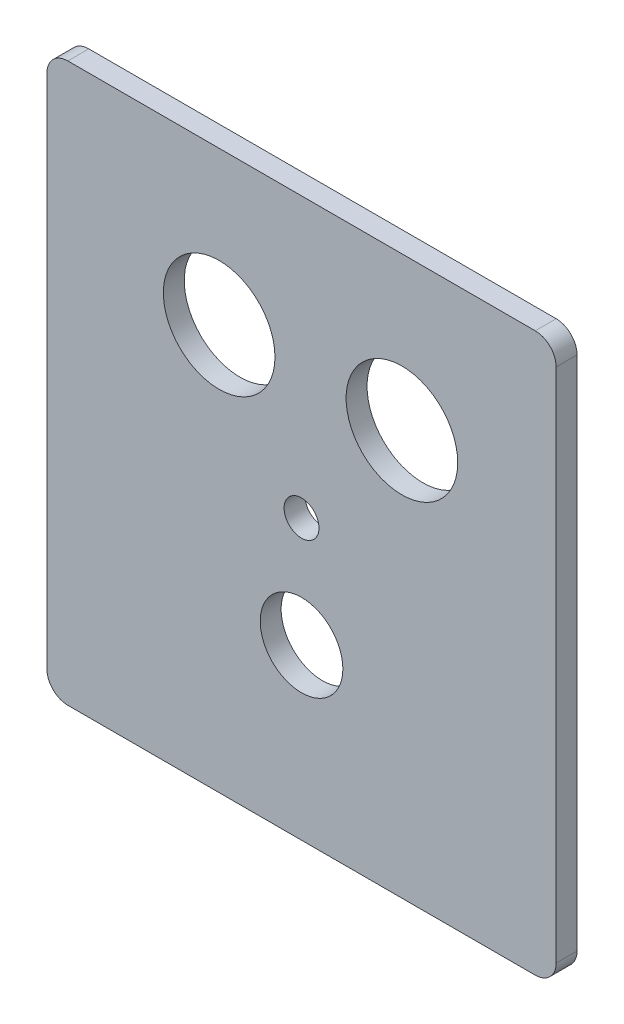
ISO-10303-21;
HEADER;
FILE_DESCRIPTION(('STEP AP214'),'2;1');
FILE_NAME('part.step','',(''),(''),'','','');
FILE_SCHEMA(('AUTOMOTIVE_DESIGN { 1 0 10303 214 1 1 1 1 }'));
ENDSEC;
DATA;
#1=APPLICATION_CONTEXT('core data for automotive mechanical design processes');
#2=APPLICATION_PROTOCOL_DEFINITION('international standard','automotive_design',2000,#1);
#3=PRODUCT_CONTEXT('',#1,'mechanical');
#4=PRODUCT('Part','Part','',(#3));
#5=PRODUCT_RELATED_PRODUCT_CATEGORY('part','',(#4));
#6=PRODUCT_DEFINITION_FORMATION('','',#4);
#7=PRODUCT_DEFINITION_CONTEXT('part definition',#1,'design');
#8=PRODUCT_DEFINITION('design','',#6,#7);
#9=PRODUCT_DEFINITION_SHAPE('','',#8);
#10=(LENGTH_UNIT() NAMED_UNIT(*) SI_UNIT(.MILLI.,.METRE.));
#11=(NAMED_UNIT(*) PLANE_ANGLE_UNIT() SI_UNIT($,.RADIAN.));
#12=(NAMED_UNIT(*) SI_UNIT($,.STERADIAN.) SOLID_ANGLE_UNIT());
#13=UNCERTAINTY_MEASURE_WITH_UNIT(LENGTH_MEASURE(1.E-05),#10,'distance_accuracy_value','');
#14=(GEOMETRIC_REPRESENTATION_CONTEXT(3) GLOBAL_UNCERTAINTY_ASSIGNED_CONTEXT((#13)) GLOBAL_UNIT_ASSIGNED_CONTEXT((#10,
#11,#12)) REPRESENTATION_CONTEXT('',''));
#15=CARTESIAN_POINT('',(0.,0.,0.));
#16=DIRECTION('',(0.,0.,1.));
#17=DIRECTION('',(1.,0.,0.));
#18=AXIS2_PLACEMENT_3D('',#15,#16,#17);
#19=CARTESIAN_POINT('',(-105.95270232816,-65.3050511466161,3.));
#20=DIRECTION('',(0.,0.,-1.));
#21=DIRECTION('',(-1.,0.,0.));
#22=AXIS2_PLACEMENT_3D('',#19,#20,#21);
#23=CYLINDRICAL_SURFACE('',#22,3.);
#24=CARTESIAN_POINT('',(-105.95270232816,-65.3050511466161,0.));
#25=DIRECTION('',(0.,0.,1.));
#26=DIRECTION('',(1.,0.,0.));
#27=AXIS2_PLACEMENT_3D('',#24,#25,#26);
#28=CIRCLE('',#27,3.);
#29=CARTESIAN_POINT('',(-108.95270232816,-65.3050511466161,0.));
#30=VERTEX_POINT('',#29);
#31=CARTESIAN_POINT('',(-105.95270232816,-68.3050511466161,0.));
#32=VERTEX_POINT('',#31);
#33=EDGE_CURVE('E129',#30,#32,#28,.T.);
#34=ORIENTED_EDGE('',*,*,#33,.T.);
#35=DIRECTION('',(0.,0.,-1.));
#36=VECTOR('',#35,1.);
#37=CARTESIAN_POINT('',(-105.95270232816,-68.3050511466161,3.));
#38=LINE('',#37,#36);
#39=CARTESIAN_POINT('',(-105.95270232816,-68.3050511466161,3.));
#40=VERTEX_POINT('',#39);
#41=EDGE_CURVE('E11',#40,#32,#38,.T.);
#42=ORIENTED_EDGE('',*,*,#41,.F.);
#43=CARTESIAN_POINT('',(-105.95270232816,-65.3050511466161,3.));
#44=DIRECTION('',(0.,0.,1.));
#45=DIRECTION('',(1.,0.,0.));
#46=AXIS2_PLACEMENT_3D('',#43,#44,#45);
#47=CIRCLE('',#46,3.);
#48=CARTESIAN_POINT('',(-108.95270232816,-65.3050511466161,3.));
#49=VERTEX_POINT('',#48);
#50=EDGE_CURVE('E144',#49,#40,#47,.T.);
#51=ORIENTED_EDGE('',*,*,#50,.F.);
#52=DIRECTION('',(0.,0.,-1.));
#53=VECTOR('',#52,1.);
#54=CARTESIAN_POINT('',(-108.95270232816,-65.3050511466161,3.));
#55=LINE('',#54,#53);
#56=EDGE_CURVE('E125',#49,#30,#55,.T.);
#57=ORIENTED_EDGE('',*,*,#56,.T.);
#58=EDGE_LOOP('',(#34,#42,#51,#57));
#59=FACE_BOUND('',#58,.T.);
#60=ADVANCED_FACE('F33',(#59),#23,.T.);
#61=CARTESIAN_POINT('',(-105.95270232816,-68.3050511466161,3.));
#62=DIRECTION('',(0.,1.,0.));
#63=DIRECTION('',(0.,0.,1.));
#64=AXIS2_PLACEMENT_3D('',#61,#62,#63);
#65=PLANE('',#64);
#66=DIRECTION('',(1.,0.,0.));
#67=VECTOR('',#66,1.);
#68=CARTESIAN_POINT('',(-105.95270232816,-68.3050511466161,0.));
#69=LINE('',#68,#67);
#70=CARTESIAN_POINT('',(-38.9527023281596,-68.3050511466161,0.));
#71=VERTEX_POINT('',#70);
#72=EDGE_CURVE('E132',#32,#71,#69,.T.);
#73=ORIENTED_EDGE('',*,*,#72,.T.);
#74=DIRECTION('',(0.,0.,-1.));
#75=VECTOR('',#74,1.);
#76=CARTESIAN_POINT('',(-38.9527023281596,-68.3050511466161,3.));
#77=LINE('',#76,#75);
#78=CARTESIAN_POINT('',(-38.9527023281596,-68.3050511466161,3.));
#79=VERTEX_POINT('',#78);
#80=EDGE_CURVE('E41',#79,#71,#77,.T.);
#81=ORIENTED_EDGE('',*,*,#80,.F.);
#82=DIRECTION('',(1.,0.,0.));
#83=VECTOR('',#82,1.);
#84=CARTESIAN_POINT('',(-105.95270232816,-68.3050511466161,3.));
#85=LINE('',#84,#83);
#86=EDGE_CURVE('E92',#40,#79,#85,.T.);
#87=ORIENTED_EDGE('',*,*,#86,.F.);
#88=ORIENTED_EDGE('',*,*,#41,.T.);
#89=EDGE_LOOP('',(#73,#81,#87,#88));
#90=FACE_BOUND('',#89,.T.);
#91=ADVANCED_FACE('F229',(#90),#65,.F.);
#92=CARTESIAN_POINT('',(-38.9527023281596,-65.3050511466161,3.));
#93=DIRECTION('',(0.,0.,-1.));
#94=DIRECTION('',(-1.,0.,0.));
#95=AXIS2_PLACEMENT_3D('',#92,#93,#94);
#96=CYLINDRICAL_SURFACE('',#95,3.);
#97=CARTESIAN_POINT('',(-38.9527023281596,-65.3050511466161,0.));
#98=DIRECTION('',(0.,0.,1.));
#99=DIRECTION('',(1.,0.,0.));
#100=AXIS2_PLACEMENT_3D('',#97,#98,#99);
#101=CIRCLE('',#100,3.);
#102=CARTESIAN_POINT('',(-35.9527023281596,-65.3050511466161,0.));
#103=VERTEX_POINT('',#102);
#104=EDGE_CURVE('E135',#71,#103,#101,.T.);
#105=ORIENTED_EDGE('',*,*,#104,.T.);
#106=DIRECTION('',(0.,0.,-1.));
#107=VECTOR('',#106,1.);
#108=CARTESIAN_POINT('',(-35.9527023281596,-65.3050511466161,3.));
#109=LINE('',#108,#107);
#110=CARTESIAN_POINT('',(-35.9527023281596,-65.3050511466161,3.));
#111=VERTEX_POINT('',#110);
#112=EDGE_CURVE('E151',#111,#103,#109,.T.);
#113=ORIENTED_EDGE('',*,*,#112,.F.);
#114=CARTESIAN_POINT('',(-38.9527023281596,-65.3050511466161,3.));
#115=DIRECTION('',(0.,0.,1.));
#116=DIRECTION('',(1.,0.,0.));
#117=AXIS2_PLACEMENT_3D('',#114,#115,#116);
#118=CIRCLE('',#117,3.);
#119=EDGE_CURVE('E159',#79,#111,#118,.T.);
#120=ORIENTED_EDGE('',*,*,#119,.F.);
#121=ORIENTED_EDGE('',*,*,#80,.T.);
#122=EDGE_LOOP('',(#105,#113,#120,#121));
#123=FACE_BOUND('',#122,.T.);
#124=ADVANCED_FACE('F157',(#123),#96,.T.);
#125=CARTESIAN_POINT('',(-35.9527023281596,8.69494885338383,3.));
#126=DIRECTION('',(-1.,0.,0.));
#127=DIRECTION('',(0.,-1.,0.));
#128=AXIS2_PLACEMENT_3D('',#125,#126,#127);
#129=PLANE('',#128);
#130=DIRECTION('',(0.,1.,0.));
#131=VECTOR('',#130,1.);
#132=CARTESIAN_POINT('',(-35.9527023281596,8.69494885338383,0.));
#133=LINE('',#132,#131);
#134=CARTESIAN_POINT('',(-35.9527023281596,8.69494885338384,0.));
#135=VERTEX_POINT('',#134);
#136=EDGE_CURVE('E137',#103,#135,#133,.T.);
#137=ORIENTED_EDGE('',*,*,#136,.T.);
#138=DIRECTION('',(0.,0.,-1.));
#139=VECTOR('',#138,1.);
#140=CARTESIAN_POINT('',(-35.9527023281596,8.69494885338384,3.));
#141=LINE('',#140,#139);
#142=CARTESIAN_POINT('',(-35.9527023281596,8.69494885338384,3.));
#143=VERTEX_POINT('',#142);
#144=EDGE_CURVE('E148',#143,#135,#141,.T.);
#145=ORIENTED_EDGE('',*,*,#144,.F.);
#146=DIRECTION('',(0.,1.,0.));
#147=VECTOR('',#146,1.);
#148=CARTESIAN_POINT('',(-35.9527023281596,8.69494885338383,3.));
#149=LINE('',#148,#147);
#150=EDGE_CURVE('E171',#111,#143,#149,.T.);
#151=ORIENTED_EDGE('',*,*,#150,.F.);
#152=ORIENTED_EDGE('',*,*,#112,.T.);
#153=EDGE_LOOP('',(#137,#145,#151,#152));
#154=FACE_BOUND('',#153,.T.);
#155=ADVANCED_FACE('F167',(#154),#129,.F.);
#156=CARTESIAN_POINT('',(-38.9527023281596,8.69494885338386,3.));
#157=DIRECTION('',(0.,0.,-1.));
#158=DIRECTION('',(-1.,0.,0.));
#159=AXIS2_PLACEMENT_3D('',#156,#157,#158);
#160=CYLINDRICAL_SURFACE('',#159,3.);
#161=CARTESIAN_POINT('',(-38.9527023281596,8.69494885338386,0.));
#162=DIRECTION('',(0.,0.,1.));
#163=DIRECTION('',(-1.,0.,0.));
#164=AXIS2_PLACEMENT_3D('',#161,#162,#163);
#165=CIRCLE('',#164,3.);
#166=CARTESIAN_POINT('',(-38.9527023281596,11.6949488533839,0.));
#167=VERTEX_POINT('',#166);
#168=EDGE_CURVE('E139',#135,#167,#165,.T.);
#169=ORIENTED_EDGE('',*,*,#168,.T.);
#170=DIRECTION('',(0.,0.,-1.));
#171=VECTOR('',#170,1.);
#172=CARTESIAN_POINT('',(-38.9527023281596,11.6949488533839,3.));
#173=LINE('',#172,#171);
#174=CARTESIAN_POINT('',(-38.9527023281596,11.6949488533839,3.));
#175=VERTEX_POINT('',#174);
#176=EDGE_CURVE('E120',#175,#167,#173,.T.);
#177=ORIENTED_EDGE('',*,*,#176,.F.);
#178=CARTESIAN_POINT('',(-38.9527023281596,8.69494885338386,3.));
#179=DIRECTION('',(0.,0.,1.));
#180=DIRECTION('',(-1.,0.,0.));
#181=AXIS2_PLACEMENT_3D('',#178,#179,#180);
#182=CIRCLE('',#181,3.);
#183=EDGE_CURVE('E111',#143,#175,#182,.T.);
#184=ORIENTED_EDGE('',*,*,#183,.F.);
#185=ORIENTED_EDGE('',*,*,#144,.T.);
#186=EDGE_LOOP('',(#169,#177,#184,#185));
#187=FACE_BOUND('',#186,.T.);
#188=ADVANCED_FACE('F170',(#187),#160,.T.);
#189=CARTESIAN_POINT('',(-105.95270232816,11.6949488533839,3.));
#190=DIRECTION('',(0.,-1.,0.));
#191=DIRECTION('',(0.,0.,-1.));
#192=AXIS2_PLACEMENT_3D('',#189,#190,#191);
#193=PLANE('',#192);
#194=DIRECTION('',(-1.,0.,0.));
#195=VECTOR('',#194,1.);
#196=CARTESIAN_POINT('',(-105.95270232816,11.6949488533839,0.));
#197=LINE('',#196,#195);
#198=CARTESIAN_POINT('',(-105.95270232816,11.6949488533839,0.));
#199=VERTEX_POINT('',#198);
#200=EDGE_CURVE('E119',#167,#199,#197,.T.);
#201=ORIENTED_EDGE('',*,*,#200,.T.);
#202=DIRECTION('',(0.,0.,-1.));
#203=VECTOR('',#202,1.);
#204=CARTESIAN_POINT('',(-105.95270232816,11.6949488533839,3.));
#205=LINE('',#204,#203);
#206=CARTESIAN_POINT('',(-105.95270232816,11.6949488533839,3.));
#207=VERTEX_POINT('',#206);
#208=EDGE_CURVE('E116',#207,#199,#205,.T.);
#209=ORIENTED_EDGE('',*,*,#208,.F.);
#210=DIRECTION('',(-1.,0.,0.));
#211=VECTOR('',#210,1.);
#212=CARTESIAN_POINT('',(-105.95270232816,11.6949488533839,3.));
#213=LINE('',#212,#211);
#214=EDGE_CURVE('E105',#175,#207,#213,.T.);
#215=ORIENTED_EDGE('',*,*,#214,.F.);
#216=ORIENTED_EDGE('',*,*,#176,.T.);
#217=EDGE_LOOP('',(#201,#209,#215,#216));
#218=FACE_BOUND('',#217,.T.);
#219=ADVANCED_FACE('F117',(#218),#193,.F.);
#220=CARTESIAN_POINT('',(-105.95270232816,8.69494885338386,3.));
#221=DIRECTION('',(0.,0.,-1.));
#222=DIRECTION('',(-1.,0.,0.));
#223=AXIS2_PLACEMENT_3D('',#220,#221,#222);
#224=CYLINDRICAL_SURFACE('',#223,3.);
#225=CARTESIAN_POINT('',(-105.95270232816,8.69494885338386,0.));
#226=DIRECTION('',(0.,0.,1.));
#227=DIRECTION('',(1.,0.,0.));
#228=AXIS2_PLACEMENT_3D('',#225,#226,#227);
#229=CIRCLE('',#228,3.);
#230=CARTESIAN_POINT('',(-108.95270232816,8.69494885338383,0.));
#231=VERTEX_POINT('',#230);
#232=EDGE_CURVE('E78',#199,#231,#229,.T.);
#233=ORIENTED_EDGE('',*,*,#232,.T.);
#234=DIRECTION('',(0.,0.,-1.));
#235=VECTOR('',#234,1.);
#236=CARTESIAN_POINT('',(-108.95270232816,8.69494885338383,3.));
#237=LINE('',#236,#235);
#238=CARTESIAN_POINT('',(-108.95270232816,8.69494885338383,3.));
#239=VERTEX_POINT('',#238);
#240=EDGE_CURVE('E121',#239,#231,#237,.T.);
#241=ORIENTED_EDGE('',*,*,#240,.F.);
#242=CARTESIAN_POINT('',(-105.95270232816,8.69494885338386,3.));
#243=DIRECTION('',(0.,0.,1.));
#244=DIRECTION('',(1.,0.,0.));
#245=AXIS2_PLACEMENT_3D('',#242,#243,#244);
#246=CIRCLE('',#245,3.);
#247=EDGE_CURVE('E109',#207,#239,#246,.T.);
#248=ORIENTED_EDGE('',*,*,#247,.F.);
#249=ORIENTED_EDGE('',*,*,#208,.T.);
#250=EDGE_LOOP('',(#233,#241,#248,#249));
#251=FACE_BOUND('',#250,.T.);
#252=ADVANCED_FACE('F123',(#251),#224,.T.);
#253=CARTESIAN_POINT('',(-108.95270232816,8.69494885338383,3.));
#254=DIRECTION('',(1.,0.,0.));
#255=DIRECTION('',(0.,1.,0.));
#256=AXIS2_PLACEMENT_3D('',#253,#254,#255);
#257=PLANE('',#256);
#258=DIRECTION('',(0.,-1.,0.));
#259=VECTOR('',#258,1.);
#260=CARTESIAN_POINT('',(-108.95270232816,8.69494885338383,0.));
#261=LINE('',#260,#259);
#262=EDGE_CURVE('E84',#231,#30,#261,.T.);
#263=ORIENTED_EDGE('',*,*,#262,.T.);
#264=ORIENTED_EDGE('',*,*,#56,.F.);
#265=DIRECTION('',(0.,-1.,0.));
#266=VECTOR('',#265,1.);
#267=CARTESIAN_POINT('',(-108.95270232816,8.69494885338383,3.));
#268=LINE('',#267,#266);
#269=EDGE_CURVE('E49',#239,#49,#268,.T.);
#270=ORIENTED_EDGE('',*,*,#269,.F.);
#271=ORIENTED_EDGE('',*,*,#240,.T.);
#272=EDGE_LOOP('',(#263,#264,#270,#271));
#273=FACE_BOUND('',#272,.T.);
#274=ADVANCED_FACE('F213',(#273),#257,.F.);
#275=CARTESIAN_POINT('',(-105.95270232816,-65.3050511466161,3.));
#276=DIRECTION('',(0.,0.,1.));
#277=DIRECTION('',(1.,0.,0.));
#278=AXIS2_PLACEMENT_3D('',#275,#276,#277);
#279=PLANE('',#278);
#280=CARTESIAN_POINT('',(-72.4527023281596,-44.0755263696735,3.));
#281=DIRECTION('',(0.,0.,1.));
#282=DIRECTION('',(1.,0.,0.));
#283=AXIS2_PLACEMENT_3D('',#280,#281,#282);
#284=CIRCLE('',#283,5.92500000000001);
#285=CARTESIAN_POINT('',(-66.5277023281596,-44.0755263696735,3.));
#286=VERTEX_POINT('',#285);
#287=EDGE_CURVE('E183',#286,#286,#284,.T.);
#288=ORIENTED_EDGE('',*,*,#287,.F.);
#289=EDGE_LOOP('',(#288));
#290=FACE_BOUND('',#289,.T.);
#291=CARTESIAN_POINT('',(-72.4543625317429,-28.3050511466161,3.));
#292=DIRECTION('',(0.,0.,1.));
#293=DIRECTION('',(1.,0.,0.));
#294=AXIS2_PLACEMENT_3D('',#291,#292,#293);
#295=CIRCLE('',#294,2.5);
#296=CARTESIAN_POINT('',(-69.9543625317429,-28.3050511466161,3.));
#297=VERTEX_POINT('',#296);
#298=EDGE_CURVE('E189',#297,#297,#295,.T.);
#299=ORIENTED_EDGE('',*,*,#298,.F.);
#300=EDGE_LOOP('',(#299));
#301=FACE_BOUND('',#300,.T.);
#302=CARTESIAN_POINT('',(-58.0627023281596,-10.2333854124384,3.));
#303=DIRECTION('',(0.,0.,1.));
#304=DIRECTION('',(1.,0.,0.));
#305=AXIS2_PLACEMENT_3D('',#302,#303,#304);
#306=CIRCLE('',#305,8.);
#307=CARTESIAN_POINT('',(-50.0627023281596,-10.2333854124384,3.));
#308=VERTEX_POINT('',#307);
#309=EDGE_CURVE('E195',#308,#308,#306,.T.);
#310=ORIENTED_EDGE('',*,*,#309,.F.);
#311=EDGE_LOOP('',(#310));
#312=FACE_BOUND('',#311,.T.);
#313=CARTESIAN_POINT('',(-84.2627023281596,-10.2333854124384,3.));
#314=DIRECTION('',(0.,0.,1.));
#315=DIRECTION('',(1.,0.,0.));
#316=AXIS2_PLACEMENT_3D('',#313,#314,#315);
#317=CIRCLE('',#316,8.);
#318=CARTESIAN_POINT('',(-76.2627023281596,-10.2333854124384,3.));
#319=VERTEX_POINT('',#318);
#320=EDGE_CURVE('E177',#319,#319,#317,.T.);
#321=ORIENTED_EDGE('',*,*,#320,.F.);
#322=EDGE_LOOP('',(#321));
#323=FACE_BOUND('',#322,.T.);
#324=ORIENTED_EDGE('',*,*,#50,.T.);
#325=ORIENTED_EDGE('',*,*,#86,.T.);
#326=ORIENTED_EDGE('',*,*,#119,.T.);
#327=ORIENTED_EDGE('',*,*,#150,.T.);
#328=ORIENTED_EDGE('',*,*,#183,.T.);
#329=ORIENTED_EDGE('',*,*,#214,.T.);
#330=ORIENTED_EDGE('',*,*,#247,.T.);
#331=ORIENTED_EDGE('',*,*,#269,.T.);
#332=EDGE_LOOP('',(#324,#325,#326,#327,#328,#329,#330,#331));
#333=FACE_BOUND('',#332,.T.);
#334=ADVANCED_FACE('F107',(#290,#301,#312,#323,#333),#279,.T.);
#335=CARTESIAN_POINT('',(-105.95270232816,-65.3050511466161,0.));
#336=DIRECTION('',(0.,0.,1.));
#337=DIRECTION('',(1.,0.,0.));
#338=AXIS2_PLACEMENT_3D('',#335,#336,#337);
#339=PLANE('',#338);
#340=CARTESIAN_POINT('',(-72.4527023281596,-44.0755263696735,0.));
#341=DIRECTION('',(0.,0.,1.));
#342=DIRECTION('',(1.,0.,0.));
#343=AXIS2_PLACEMENT_3D('',#340,#341,#342);
#344=CIRCLE('',#343,5.92500000000001);
#345=CARTESIAN_POINT('',(-66.5277023281596,-44.0755263696735,0.));
#346=VERTEX_POINT('',#345);
#347=EDGE_CURVE('E186',#346,#346,#344,.T.);
#348=ORIENTED_EDGE('',*,*,#347,.T.);
#349=EDGE_LOOP('',(#348));
#350=FACE_BOUND('',#349,.T.);
#351=CARTESIAN_POINT('',(-72.4543625317429,-28.3050511466161,0.));
#352=DIRECTION('',(0.,0.,1.));
#353=DIRECTION('',(1.,0.,0.));
#354=AXIS2_PLACEMENT_3D('',#351,#352,#353);
#355=CIRCLE('',#354,2.5);
#356=CARTESIAN_POINT('',(-69.9543625317429,-28.3050511466161,0.));
#357=VERTEX_POINT('',#356);
#358=EDGE_CURVE('E192',#357,#357,#355,.T.);
#359=ORIENTED_EDGE('',*,*,#358,.T.);
#360=EDGE_LOOP('',(#359));
#361=FACE_BOUND('',#360,.T.);
#362=CARTESIAN_POINT('',(-58.0627023281596,-10.2333854124384,0.));
#363=DIRECTION('',(0.,0.,1.));
#364=DIRECTION('',(1.,0.,0.));
#365=AXIS2_PLACEMENT_3D('',#362,#363,#364);
#366=CIRCLE('',#365,8.);
#367=CARTESIAN_POINT('',(-50.0627023281596,-10.2333854124384,0.));
#368=VERTEX_POINT('',#367);
#369=EDGE_CURVE('E180',#368,#368,#366,.T.);
#370=ORIENTED_EDGE('',*,*,#369,.T.);
#371=EDGE_LOOP('',(#370));
#372=FACE_BOUND('',#371,.T.);
#373=CARTESIAN_POINT('',(-84.2627023281596,-10.2333854124384,0.));
#374=DIRECTION('',(0.,0.,1.));
#375=DIRECTION('',(1.,0.,0.));
#376=AXIS2_PLACEMENT_3D('',#373,#374,#375);
#377=CIRCLE('',#376,8.);
#378=CARTESIAN_POINT('',(-76.2627023281596,-10.2333854124384,0.));
#379=VERTEX_POINT('',#378);
#380=EDGE_CURVE('E133',#379,#379,#377,.T.);
#381=ORIENTED_EDGE('',*,*,#380,.T.);
#382=EDGE_LOOP('',(#381));
#383=FACE_BOUND('',#382,.T.);
#384=ORIENTED_EDGE('',*,*,#33,.F.);
#385=ORIENTED_EDGE('',*,*,#262,.F.);
#386=ORIENTED_EDGE('',*,*,#232,.F.);
#387=ORIENTED_EDGE('',*,*,#200,.F.);
#388=ORIENTED_EDGE('',*,*,#168,.F.);
#389=ORIENTED_EDGE('',*,*,#136,.F.);
#390=ORIENTED_EDGE('',*,*,#104,.F.);
#391=ORIENTED_EDGE('',*,*,#72,.F.);
#392=EDGE_LOOP('',(#384,#385,#386,#387,#388,#389,#390,#391));
#393=FACE_BOUND('',#392,.T.);
#394=ADVANCED_FACE('F163',(#350,#361,#372,#383,#393),#339,.F.);
#395=CARTESIAN_POINT('',(-84.2627023281596,-10.2333854124384,0.));
#396=DIRECTION('',(0.,0.,1.));
#397=DIRECTION('',(1.,0.,0.));
#398=AXIS2_PLACEMENT_3D('',#395,#396,#397);
#399=CYLINDRICAL_SURFACE('',#398,8.);
#400=ORIENTED_EDGE('',*,*,#380,.F.);
#401=EDGE_LOOP('',(#400));
#402=FACE_BOUND('',#401,.T.);
#403=ORIENTED_EDGE('',*,*,#320,.T.);
#404=EDGE_LOOP('',(#403));
#405=FACE_BOUND('',#404,.T.);
#406=ADVANCED_FACE('F207',(#402,#405),#399,.F.);
#407=CARTESIAN_POINT('',(-58.0627023281596,-10.2333854124384,0.));
#408=DIRECTION('',(0.,0.,1.));
#409=DIRECTION('',(1.,0.,0.));
#410=AXIS2_PLACEMENT_3D('',#407,#408,#409);
#411=CYLINDRICAL_SURFACE('',#410,8.);
#412=ORIENTED_EDGE('',*,*,#369,.F.);
#413=EDGE_LOOP('',(#412));
#414=FACE_BOUND('',#413,.T.);
#415=ORIENTED_EDGE('',*,*,#309,.T.);
#416=EDGE_LOOP('',(#415));
#417=FACE_BOUND('',#416,.T.);
#418=ADVANCED_FACE('F203',(#414,#417),#411,.F.);
#419=CARTESIAN_POINT('',(-72.4543625317429,-28.3050511466161,0.));
#420=DIRECTION('',(0.,0.,1.));
#421=DIRECTION('',(1.,0.,0.));
#422=AXIS2_PLACEMENT_3D('',#419,#420,#421);
#423=CYLINDRICAL_SURFACE('',#422,2.5);
#424=ORIENTED_EDGE('',*,*,#358,.F.);
#425=EDGE_LOOP('',(#424));
#426=FACE_BOUND('',#425,.T.);
#427=ORIENTED_EDGE('',*,*,#298,.T.);
#428=EDGE_LOOP('',(#427));
#429=FACE_BOUND('',#428,.T.);
#430=ADVANCED_FACE('F206',(#426,#429),#423,.F.);
#431=CARTESIAN_POINT('',(-72.4527023281596,-44.0755263696735,0.));
#432=DIRECTION('',(0.,0.,1.));
#433=DIRECTION('',(1.,0.,0.));
#434=AXIS2_PLACEMENT_3D('',#431,#432,#433);
#435=CYLINDRICAL_SURFACE('',#434,5.92500000000001);
#436=ORIENTED_EDGE('',*,*,#347,.F.);
#437=EDGE_LOOP('',(#436));
#438=FACE_BOUND('',#437,.T.);
#439=ORIENTED_EDGE('',*,*,#287,.T.);
#440=EDGE_LOOP('',(#439));
#441=FACE_BOUND('',#440,.T.);
#442=ADVANCED_FACE('F305',(#438,#441),#435,.F.);
#443=CLOSED_SHELL('',(#60,#91,#124,#155,#188,#219,#252,#274,#334,#394,#406,#418,#430,#442));
#444=MANIFOLD_SOLID_BREP('B2',#443);
#445=ADVANCED_BREP_SHAPE_REPRESENTATION('',(#18,#444),#14);
#446=SHAPE_DEFINITION_REPRESENTATION(#9,#445);
ENDSEC;
END-ISO-10303-21;
